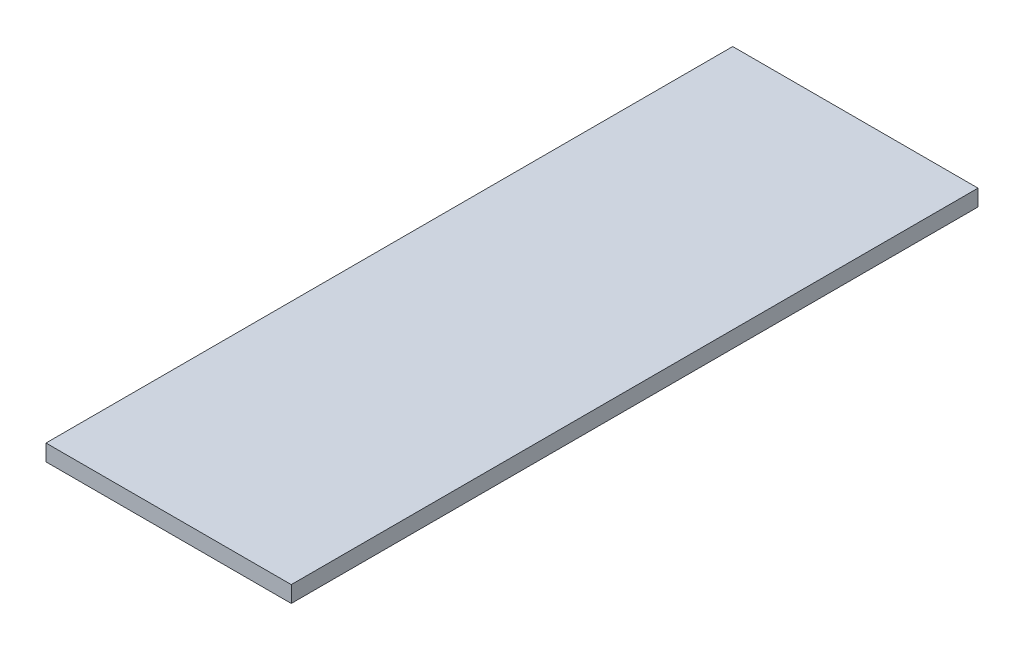
ISO-10303-21;
HEADER;
FILE_DESCRIPTION(('STEP AP214'),'2;1');
FILE_NAME('part.step','',(''),(''),'','','');
FILE_SCHEMA(('AUTOMOTIVE_DESIGN { 1 0 10303 214 1 1 1 1 }'));
ENDSEC;
DATA;
#1=APPLICATION_CONTEXT('core data for automotive mechanical design processes');
#2=APPLICATION_PROTOCOL_DEFINITION('international standard','automotive_design',2000,#1);
#3=PRODUCT_CONTEXT('',#1,'mechanical');
#4=PRODUCT('Part','Part','',(#3));
#5=PRODUCT_RELATED_PRODUCT_CATEGORY('part','',(#4));
#6=PRODUCT_DEFINITION_FORMATION('','',#4);
#7=PRODUCT_DEFINITION_CONTEXT('part definition',#1,'design');
#8=PRODUCT_DEFINITION('design','',#6,#7);
#9=PRODUCT_DEFINITION_SHAPE('','',#8);
#10=(LENGTH_UNIT() NAMED_UNIT(*) SI_UNIT(.MILLI.,.METRE.));
#11=(NAMED_UNIT(*) PLANE_ANGLE_UNIT() SI_UNIT($,.RADIAN.));
#12=(NAMED_UNIT(*) SI_UNIT($,.STERADIAN.) SOLID_ANGLE_UNIT());
#13=UNCERTAINTY_MEASURE_WITH_UNIT(LENGTH_MEASURE(1.E-05),#10,'distance_accuracy_value','');
#14=(GEOMETRIC_REPRESENTATION_CONTEXT(3) GLOBAL_UNCERTAINTY_ASSIGNED_CONTEXT((#13)) GLOBAL_UNIT_ASSIGNED_CONTEXT((#10,
#11,#12)) REPRESENTATION_CONTEXT('',''));
#15=CARTESIAN_POINT('',(0.,0.,0.));
#16=DIRECTION('',(0.,0.,1.));
#17=DIRECTION('',(1.,0.,0.));
#18=AXIS2_PLACEMENT_3D('',#15,#16,#17);
#19=CARTESIAN_POINT('',(0.,5.,0.));
#20=DIRECTION('',(1.,0.,0.));
#21=DIRECTION('',(0.,0.,-1.));
#22=AXIS2_PLACEMENT_3D('',#19,#20,#21);
#23=PLANE('',#22);
#24=DIRECTION('',(0.,0.,1.));
#25=VECTOR('',#24,1.);
#26=CARTESIAN_POINT('',(0.,0.,0.));
#27=LINE('',#26,#25);
#28=CARTESIAN_POINT('',(0.,0.,-210.));
#29=VERTEX_POINT('',#28);
#30=CARTESIAN_POINT('',(0.,0.,0.));
#31=VERTEX_POINT('',#30);
#32=EDGE_CURVE('E98',#29,#31,#27,.T.);
#33=ORIENTED_EDGE('',*,*,#32,.T.);
#34=DIRECTION('',(0.,-1.,0.));
#35=VECTOR('',#34,1.);
#36=CARTESIAN_POINT('',(0.,5.,0.));
#37=LINE('',#36,#35);
#38=CARTESIAN_POINT('',(0.,5.,0.));
#39=VERTEX_POINT('',#38);
#40=EDGE_CURVE('E11',#39,#31,#37,.T.);
#41=ORIENTED_EDGE('',*,*,#40,.F.);
#42=DIRECTION('',(0.,0.,1.));
#43=VECTOR('',#42,1.);
#44=CARTESIAN_POINT('',(0.,5.,0.));
#45=LINE('',#44,#43);
#46=CARTESIAN_POINT('',(0.,5.,-210.));
#47=VERTEX_POINT('',#46);
#48=EDGE_CURVE('E86',#47,#39,#45,.T.);
#49=ORIENTED_EDGE('',*,*,#48,.F.);
#50=DIRECTION('',(0.,-1.,0.));
#51=VECTOR('',#50,1.);
#52=CARTESIAN_POINT('',(0.,5.,-210.));
#53=LINE('',#52,#51);
#54=EDGE_CURVE('E94',#47,#29,#53,.T.);
#55=ORIENTED_EDGE('',*,*,#54,.T.);
#56=EDGE_LOOP('',(#33,#41,#49,#55));
#57=FACE_BOUND('',#56,.T.);
#58=ADVANCED_FACE('F35',(#57),#23,.F.);
#59=CARTESIAN_POINT('',(0.,5.,0.));
#60=DIRECTION('',(0.,0.,-1.));
#61=DIRECTION('',(-1.,0.,0.));
#62=AXIS2_PLACEMENT_3D('',#59,#60,#61);
#63=PLANE('',#62);
#64=DIRECTION('',(1.,0.,0.));
#65=VECTOR('',#64,1.);
#66=CARTESIAN_POINT('',(0.,0.,0.));
#67=LINE('',#66,#65);
#68=CARTESIAN_POINT('',(75.,0.,0.));
#69=VERTEX_POINT('',#68);
#70=EDGE_CURVE('E90',#31,#69,#67,.T.);
#71=ORIENTED_EDGE('',*,*,#70,.T.);
#72=DIRECTION('',(0.,-1.,0.));
#73=VECTOR('',#72,1.);
#74=CARTESIAN_POINT('',(75.,5.,0.));
#75=LINE('',#74,#73);
#76=CARTESIAN_POINT('',(75.,5.,0.));
#77=VERTEX_POINT('',#76);
#78=EDGE_CURVE('E43',#77,#69,#75,.T.);
#79=ORIENTED_EDGE('',*,*,#78,.F.);
#80=DIRECTION('',(1.,0.,0.));
#81=VECTOR('',#80,1.);
#82=CARTESIAN_POINT('',(0.,5.,0.));
#83=LINE('',#82,#81);
#84=EDGE_CURVE('E81',#39,#77,#83,.T.);
#85=ORIENTED_EDGE('',*,*,#84,.F.);
#86=ORIENTED_EDGE('',*,*,#40,.T.);
#87=EDGE_LOOP('',(#71,#79,#85,#86));
#88=FACE_BOUND('',#87,.T.);
#89=ADVANCED_FACE('F89',(#88),#63,.F.);
#90=CARTESIAN_POINT('',(75.,5.,0.));
#91=DIRECTION('',(-1.,0.,0.));
#92=DIRECTION('',(0.,0.,1.));
#93=AXIS2_PLACEMENT_3D('',#90,#91,#92);
#94=PLANE('',#93);
#95=DIRECTION('',(0.,0.,-1.));
#96=VECTOR('',#95,1.);
#97=CARTESIAN_POINT('',(75.,0.,0.));
#98=LINE('',#97,#96);
#99=CARTESIAN_POINT('',(75.,0.,-210.));
#100=VERTEX_POINT('',#99);
#101=EDGE_CURVE('E68',#69,#100,#98,.T.);
#102=ORIENTED_EDGE('',*,*,#101,.T.);
#103=DIRECTION('',(0.,-1.,0.));
#104=VECTOR('',#103,1.);
#105=CARTESIAN_POINT('',(75.,5.,-210.));
#106=LINE('',#105,#104);
#107=CARTESIAN_POINT('',(75.,5.,-210.));
#108=VERTEX_POINT('',#107);
#109=EDGE_CURVE('E91',#108,#100,#106,.T.);
#110=ORIENTED_EDGE('',*,*,#109,.F.);
#111=DIRECTION('',(0.,0.,-1.));
#112=VECTOR('',#111,1.);
#113=CARTESIAN_POINT('',(75.,5.,0.));
#114=LINE('',#113,#112);
#115=EDGE_CURVE('E84',#77,#108,#114,.T.);
#116=ORIENTED_EDGE('',*,*,#115,.F.);
#117=ORIENTED_EDGE('',*,*,#78,.T.);
#118=EDGE_LOOP('',(#102,#110,#116,#117));
#119=FACE_BOUND('',#118,.T.);
#120=ADVANCED_FACE('F92',(#119),#94,.F.);
#121=CARTESIAN_POINT('',(0.,5.,-210.));
#122=DIRECTION('',(0.,0.,1.));
#123=DIRECTION('',(1.,0.,0.));
#124=AXIS2_PLACEMENT_3D('',#121,#122,#123);
#125=PLANE('',#124);
#126=DIRECTION('',(-1.,0.,0.));
#127=VECTOR('',#126,1.);
#128=CARTESIAN_POINT('',(0.,0.,-210.));
#129=LINE('',#128,#127);
#130=EDGE_CURVE('E74',#100,#29,#129,.T.);
#131=ORIENTED_EDGE('',*,*,#130,.T.);
#132=ORIENTED_EDGE('',*,*,#54,.F.);
#133=DIRECTION('',(-1.,0.,0.));
#134=VECTOR('',#133,1.);
#135=CARTESIAN_POINT('',(0.,5.,-210.));
#136=LINE('',#135,#134);
#137=EDGE_CURVE('E51',#108,#47,#136,.T.);
#138=ORIENTED_EDGE('',*,*,#137,.F.);
#139=ORIENTED_EDGE('',*,*,#109,.T.);
#140=EDGE_LOOP('',(#131,#132,#138,#139));
#141=FACE_BOUND('',#140,.T.);
#142=ADVANCED_FACE('F105',(#141),#125,.F.);
#143=CARTESIAN_POINT('',(0.,5.,0.));
#144=DIRECTION('',(0.,-1.,0.));
#145=DIRECTION('',(0.,0.,-1.));
#146=AXIS2_PLACEMENT_3D('',#143,#144,#145);
#147=PLANE('',#146);
#148=ORIENTED_EDGE('',*,*,#48,.T.);
#149=ORIENTED_EDGE('',*,*,#84,.T.);
#150=ORIENTED_EDGE('',*,*,#115,.T.);
#151=ORIENTED_EDGE('',*,*,#137,.T.);
#152=EDGE_LOOP('',(#148,#149,#150,#151));
#153=FACE_BOUND('',#152,.T.);
#154=ADVANCED_FACE('F82',(#153),#147,.F.);
#155=CARTESIAN_POINT('',(0.,0.,0.));
#156=DIRECTION('',(0.,-1.,0.));
#157=DIRECTION('',(0.,0.,-1.));
#158=AXIS2_PLACEMENT_3D('',#155,#156,#157);
#159=PLANE('',#158);
#160=ORIENTED_EDGE('',*,*,#32,.F.);
#161=ORIENTED_EDGE('',*,*,#130,.F.);
#162=ORIENTED_EDGE('',*,*,#101,.F.);
#163=ORIENTED_EDGE('',*,*,#70,.F.);
#164=EDGE_LOOP('',(#160,#161,#162,#163));
#165=FACE_BOUND('',#164,.T.);
#166=ADVANCED_FACE('F108',(#165),#159,.T.);
#167=CLOSED_SHELL('',(#58,#89,#120,#142,#154,#166));
#168=MANIFOLD_SOLID_BREP('B2',#167);
#169=ADVANCED_BREP_SHAPE_REPRESENTATION('',(#18,#168),#14);
#170=SHAPE_DEFINITION_REPRESENTATION(#9,#169);
ENDSEC;
END-ISO-10303-21;
